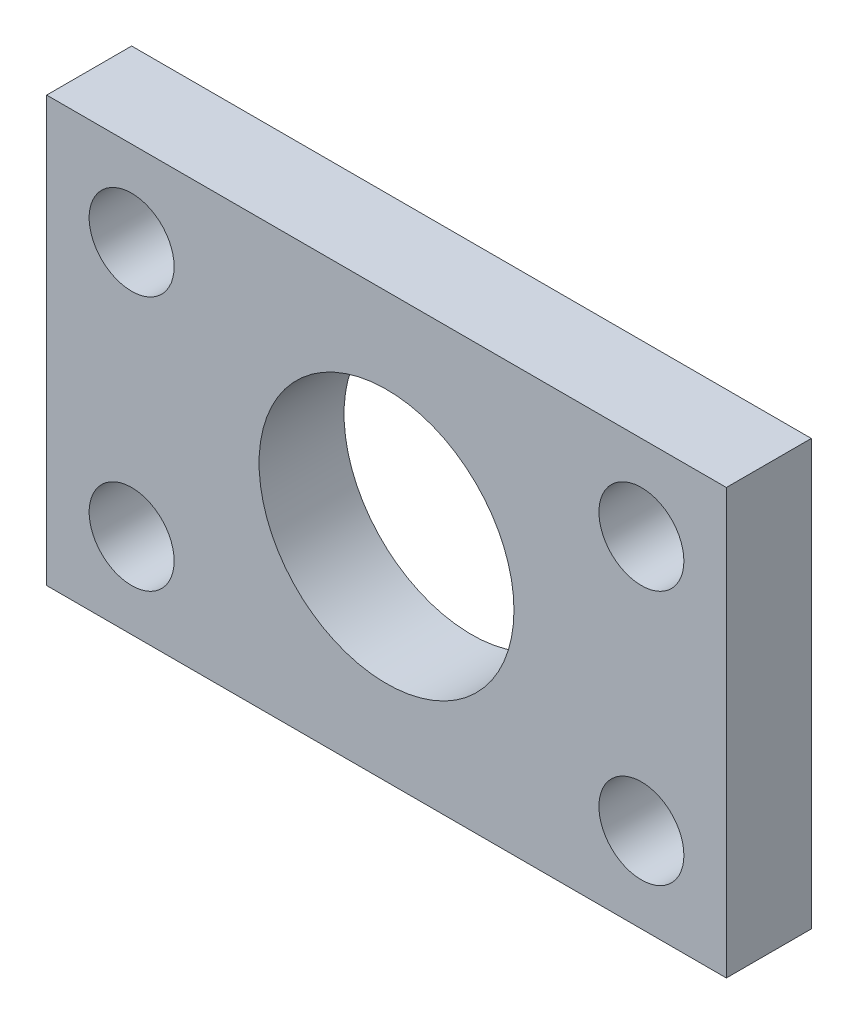
ISO-10303-21;
HEADER;
FILE_DESCRIPTION(('STEP AP214'),'2;1');
FILE_NAME('part.step','',(''),(''),'','','');
FILE_SCHEMA(('AUTOMOTIVE_DESIGN { 1 0 10303 214 1 1 1 1 }'));
ENDSEC;
DATA;
#1=APPLICATION_CONTEXT('core data for automotive mechanical design processes');
#2=APPLICATION_PROTOCOL_DEFINITION('international standard','automotive_design',2000,#1);
#3=PRODUCT_CONTEXT('',#1,'mechanical');
#4=PRODUCT('Part','Part','',(#3));
#5=PRODUCT_RELATED_PRODUCT_CATEGORY('part','',(#4));
#6=PRODUCT_DEFINITION_FORMATION('','',#4);
#7=PRODUCT_DEFINITION_CONTEXT('part definition',#1,'design');
#8=PRODUCT_DEFINITION('design','',#6,#7);
#9=PRODUCT_DEFINITION_SHAPE('','',#8);
#10=(LENGTH_UNIT() NAMED_UNIT(*) SI_UNIT(.MILLI.,.METRE.));
#11=(NAMED_UNIT(*) PLANE_ANGLE_UNIT() SI_UNIT($,.RADIAN.));
#12=(NAMED_UNIT(*) SI_UNIT($,.STERADIAN.) SOLID_ANGLE_UNIT());
#13=UNCERTAINTY_MEASURE_WITH_UNIT(LENGTH_MEASURE(1.E-05),#10,'distance_accuracy_value','');
#14=(GEOMETRIC_REPRESENTATION_CONTEXT(3) GLOBAL_UNCERTAINTY_ASSIGNED_CONTEXT((#13)) GLOBAL_UNIT_ASSIGNED_CONTEXT((#10,
#11,#12)) REPRESENTATION_CONTEXT('',''));
#15=CARTESIAN_POINT('',(0.,0.,0.));
#16=DIRECTION('',(0.,0.,1.));
#17=DIRECTION('',(1.,0.,0.));
#18=AXIS2_PLACEMENT_3D('',#15,#16,#17);
#19=CARTESIAN_POINT('',(0.,0.,25.4));
#20=DIRECTION('',(0.,0.,1.));
#21=DIRECTION('',(1.,0.,0.));
#22=AXIS2_PLACEMENT_3D('',#19,#20,#21);
#23=PLANE('',#22);
#24=CARTESIAN_POINT('',(76.2,38.1,25.4));
#25=DIRECTION('',(0.,0.,1.));
#26=DIRECTION('',(1.,0.,0.));
#27=AXIS2_PLACEMENT_3D('',#24,#25,#26);
#28=CIRCLE('',#27,12.7);
#29=CARTESIAN_POINT('',(88.9,38.1,25.4));
#30=VERTEX_POINT('',#29);
#31=EDGE_CURVE('E131',#30,#30,#28,.T.);
#32=ORIENTED_EDGE('',*,*,#31,.F.);
#33=EDGE_LOOP('',(#32));
#34=FACE_BOUND('',#33,.T.);
#35=CARTESIAN_POINT('',(76.2,-38.1,25.4));
#36=DIRECTION('',(0.,0.,1.));
#37=DIRECTION('',(1.,0.,0.));
#38=AXIS2_PLACEMENT_3D('',#35,#36,#37);
#39=CIRCLE('',#38,12.7);
#40=CARTESIAN_POINT('',(88.9,-38.1,25.4));
#41=VERTEX_POINT('',#40);
#42=EDGE_CURVE('E119',#41,#41,#39,.T.);
#43=ORIENTED_EDGE('',*,*,#42,.F.);
#44=EDGE_LOOP('',(#43));
#45=FACE_BOUND('',#44,.T.);
#46=DIRECTION('',(0.,-1.,0.));
#47=VECTOR('',#46,1.);
#48=CARTESIAN_POINT('',(-101.6,63.5,25.4));
#49=LINE('',#48,#47);
#50=CARTESIAN_POINT('',(-101.6,63.5,25.4));
#51=VERTEX_POINT('',#50);
#52=CARTESIAN_POINT('',(-101.6,-63.5,25.4));
#53=VERTEX_POINT('',#52);
#54=EDGE_CURVE('E89',#51,#53,#49,.T.);
#55=ORIENTED_EDGE('',*,*,#54,.T.);
#56=DIRECTION('',(1.,0.,0.));
#57=VECTOR('',#56,1.);
#58=CARTESIAN_POINT('',(-101.6,-63.5,25.4));
#59=LINE('',#58,#57);
#60=CARTESIAN_POINT('',(101.6,-63.5,25.4));
#61=VERTEX_POINT('',#60);
#62=EDGE_CURVE('E84',#53,#61,#59,.T.);
#63=ORIENTED_EDGE('',*,*,#62,.T.);
#64=DIRECTION('',(0.,1.,0.));
#65=VECTOR('',#64,1.);
#66=CARTESIAN_POINT('',(101.6,63.5,25.4));
#67=LINE('',#66,#65);
#68=CARTESIAN_POINT('',(101.6,63.5,25.4));
#69=VERTEX_POINT('',#68);
#70=EDGE_CURVE('E87',#61,#69,#67,.T.);
#71=ORIENTED_EDGE('',*,*,#70,.T.);
#72=DIRECTION('',(-1.,0.,0.));
#73=VECTOR('',#72,1.);
#74=CARTESIAN_POINT('',(-101.6,63.5,25.4));
#75=LINE('',#74,#73);
#76=EDGE_CURVE('E54',#69,#51,#75,.T.);
#77=ORIENTED_EDGE('',*,*,#76,.T.);
#78=EDGE_LOOP('',(#55,#63,#71,#77));
#79=FACE_BOUND('',#78,.T.);
#80=CARTESIAN_POINT('',(-76.2,38.1,25.4));
#81=DIRECTION('',(0.,0.,1.));
#82=DIRECTION('',(1.,0.,0.));
#83=AXIS2_PLACEMENT_3D('',#80,#81,#82);
#84=CIRCLE('',#83,12.7);
#85=CARTESIAN_POINT('',(-63.5,38.1,25.4));
#86=VERTEX_POINT('',#85);
#87=EDGE_CURVE('E104',#86,#86,#84,.T.);
#88=ORIENTED_EDGE('',*,*,#87,.F.);
#89=EDGE_LOOP('',(#88));
#90=FACE_BOUND('',#89,.T.);
#91=CARTESIAN_POINT('',(-76.2,-38.1,25.4));
#92=DIRECTION('',(0.,0.,1.));
#93=DIRECTION('',(1.,0.,0.));
#94=AXIS2_PLACEMENT_3D('',#91,#92,#93);
#95=CIRCLE('',#94,12.7);
#96=CARTESIAN_POINT('',(-63.5,-38.1,25.4));
#97=VERTEX_POINT('',#96);
#98=EDGE_CURVE('E125',#97,#97,#95,.T.);
#99=ORIENTED_EDGE('',*,*,#98,.F.);
#100=EDGE_LOOP('',(#99));
#101=FACE_BOUND('',#100,.T.);
#102=CARTESIAN_POINT('',(0.,0.,25.4));
#103=DIRECTION('',(0.,0.,1.));
#104=DIRECTION('',(1.,0.,0.));
#105=AXIS2_PLACEMENT_3D('',#102,#103,#104);
#106=CIRCLE('',#105,38.1);
#107=CARTESIAN_POINT('',(38.1,0.,25.4));
#108=VERTEX_POINT('',#107);
#109=EDGE_CURVE('E137',#108,#108,#106,.T.);
#110=ORIENTED_EDGE('',*,*,#109,.F.);
#111=EDGE_LOOP('',(#110));
#112=FACE_BOUND('',#111,.T.);
#113=ADVANCED_FACE('F37',(#34,#45,#79,#90,#101,#112),#23,.T.);
#114=CARTESIAN_POINT('',(0.,0.,0.));
#115=DIRECTION('',(0.,0.,1.));
#116=DIRECTION('',(1.,0.,0.));
#117=AXIS2_PLACEMENT_3D('',#114,#115,#116);
#118=PLANE('',#117);
#119=DIRECTION('',(0.,-1.,0.));
#120=VECTOR('',#119,1.);
#121=CARTESIAN_POINT('',(-101.6,63.5,0.));
#122=LINE('',#121,#120);
#123=CARTESIAN_POINT('',(-101.6,63.5,0.));
#124=VERTEX_POINT('',#123);
#125=CARTESIAN_POINT('',(-101.6,-63.5,0.));
#126=VERTEX_POINT('',#125);
#127=EDGE_CURVE('E101',#124,#126,#122,.T.);
#128=ORIENTED_EDGE('',*,*,#127,.F.);
#129=DIRECTION('',(-1.,0.,0.));
#130=VECTOR('',#129,1.);
#131=CARTESIAN_POINT('',(-101.6,63.5,0.));
#132=LINE('',#131,#130);
#133=CARTESIAN_POINT('',(101.6,63.5,0.));
#134=VERTEX_POINT('',#133);
#135=EDGE_CURVE('E77',#134,#124,#132,.T.);
#136=ORIENTED_EDGE('',*,*,#135,.F.);
#137=DIRECTION('',(0.,1.,0.));
#138=VECTOR('',#137,1.);
#139=CARTESIAN_POINT('',(101.6,63.5,0.));
#140=LINE('',#139,#138);
#141=CARTESIAN_POINT('',(101.6,-63.5,0.));
#142=VERTEX_POINT('',#141);
#143=EDGE_CURVE('E71',#142,#134,#140,.T.);
#144=ORIENTED_EDGE('',*,*,#143,.F.);
#145=DIRECTION('',(1.,0.,0.));
#146=VECTOR('',#145,1.);
#147=CARTESIAN_POINT('',(-101.6,-63.5,0.));
#148=LINE('',#147,#146);
#149=EDGE_CURVE('E93',#126,#142,#148,.T.);
#150=ORIENTED_EDGE('',*,*,#149,.F.);
#151=EDGE_LOOP('',(#128,#136,#144,#150));
#152=FACE_BOUND('',#151,.T.);
#153=CARTESIAN_POINT('',(-76.2,38.1,0.));
#154=DIRECTION('',(0.,0.,1.));
#155=DIRECTION('',(1.,0.,0.));
#156=AXIS2_PLACEMENT_3D('',#153,#154,#155);
#157=CIRCLE('',#156,12.7);
#158=CARTESIAN_POINT('',(-63.5,38.1,0.));
#159=VERTEX_POINT('',#158);
#160=EDGE_CURVE('E116',#159,#159,#157,.T.);
#161=ORIENTED_EDGE('',*,*,#160,.T.);
#162=EDGE_LOOP('',(#161));
#163=FACE_BOUND('',#162,.T.);
#164=CARTESIAN_POINT('',(76.2,-38.1,0.));
#165=DIRECTION('',(0.,0.,1.));
#166=DIRECTION('',(1.,0.,0.));
#167=AXIS2_PLACEMENT_3D('',#164,#165,#166);
#168=CIRCLE('',#167,12.7);
#169=CARTESIAN_POINT('',(88.9,-38.1,0.));
#170=VERTEX_POINT('',#169);
#171=EDGE_CURVE('E122',#170,#170,#168,.T.);
#172=ORIENTED_EDGE('',*,*,#171,.T.);
#173=EDGE_LOOP('',(#172));
#174=FACE_BOUND('',#173,.T.);
#175=CARTESIAN_POINT('',(-76.2,-38.1,0.));
#176=DIRECTION('',(0.,0.,1.));
#177=DIRECTION('',(1.,0.,0.));
#178=AXIS2_PLACEMENT_3D('',#175,#176,#177);
#179=CIRCLE('',#178,12.7);
#180=CARTESIAN_POINT('',(-63.5,-38.1,0.));
#181=VERTEX_POINT('',#180);
#182=EDGE_CURVE('E128',#181,#181,#179,.T.);
#183=ORIENTED_EDGE('',*,*,#182,.T.);
#184=EDGE_LOOP('',(#183));
#185=FACE_BOUND('',#184,.T.);
#186=CARTESIAN_POINT('',(76.2,38.1,0.));
#187=DIRECTION('',(0.,0.,1.));
#188=DIRECTION('',(1.,0.,0.));
#189=AXIS2_PLACEMENT_3D('',#186,#187,#188);
#190=CIRCLE('',#189,12.7);
#191=CARTESIAN_POINT('',(88.9,38.1,0.));
#192=VERTEX_POINT('',#191);
#193=EDGE_CURVE('E134',#192,#192,#190,.T.);
#194=ORIENTED_EDGE('',*,*,#193,.T.);
#195=EDGE_LOOP('',(#194));
#196=FACE_BOUND('',#195,.T.);
#197=CARTESIAN_POINT('',(0.,0.,0.));
#198=DIRECTION('',(0.,0.,1.));
#199=DIRECTION('',(1.,0.,0.));
#200=AXIS2_PLACEMENT_3D('',#197,#198,#199);
#201=CIRCLE('',#200,38.1);
#202=CARTESIAN_POINT('',(38.1,0.,0.));
#203=VERTEX_POINT('',#202);
#204=EDGE_CURVE('E140',#203,#203,#201,.T.);
#205=ORIENTED_EDGE('',*,*,#204,.T.);
#206=EDGE_LOOP('',(#205));
#207=FACE_BOUND('',#206,.T.);
#208=ADVANCED_FACE('F112',(#152,#163,#174,#185,#196,#207),#118,.F.);
#209=CARTESIAN_POINT('',(-101.6,63.5,25.4));
#210=DIRECTION('',(1.,0.,0.));
#211=DIRECTION('',(0.,0.,-1.));
#212=AXIS2_PLACEMENT_3D('',#209,#210,#211);
#213=PLANE('',#212);
#214=ORIENTED_EDGE('',*,*,#127,.T.);
#215=DIRECTION('',(0.,0.,-1.));
#216=VECTOR('',#215,1.);
#217=CARTESIAN_POINT('',(-101.6,-63.5,25.4));
#218=LINE('',#217,#216);
#219=EDGE_CURVE('E11',#53,#126,#218,.T.);
#220=ORIENTED_EDGE('',*,*,#219,.F.);
#221=ORIENTED_EDGE('',*,*,#54,.F.);
#222=DIRECTION('',(0.,0.,-1.));
#223=VECTOR('',#222,1.);
#224=CARTESIAN_POINT('',(-101.6,63.5,25.4));
#225=LINE('',#224,#223);
#226=EDGE_CURVE('E97',#51,#124,#225,.T.);
#227=ORIENTED_EDGE('',*,*,#226,.T.);
#228=EDGE_LOOP('',(#214,#220,#221,#227));
#229=FACE_BOUND('',#228,.T.);
#230=ADVANCED_FACE('F39',(#229),#213,.F.);
#231=CARTESIAN_POINT('',(-101.6,-63.5,25.4));
#232=DIRECTION('',(0.,1.,0.));
#233=DIRECTION('',(0.,0.,1.));
#234=AXIS2_PLACEMENT_3D('',#231,#232,#233);
#235=PLANE('',#234);
#236=ORIENTED_EDGE('',*,*,#149,.T.);
#237=DIRECTION('',(0.,0.,-1.));
#238=VECTOR('',#237,1.);
#239=CARTESIAN_POINT('',(101.6,-63.5,25.4));
#240=LINE('',#239,#238);
#241=EDGE_CURVE('E46',#61,#142,#240,.T.);
#242=ORIENTED_EDGE('',*,*,#241,.F.);
#243=ORIENTED_EDGE('',*,*,#62,.F.);
#244=ORIENTED_EDGE('',*,*,#219,.T.);
#245=EDGE_LOOP('',(#236,#242,#243,#244));
#246=FACE_BOUND('',#245,.T.);
#247=ADVANCED_FACE('F92',(#246),#235,.F.);
#248=CARTESIAN_POINT('',(101.6,63.5,25.4));
#249=DIRECTION('',(-1.,0.,0.));
#250=DIRECTION('',(0.,-1.,0.));
#251=AXIS2_PLACEMENT_3D('',#248,#249,#250);
#252=PLANE('',#251);
#253=ORIENTED_EDGE('',*,*,#143,.T.);
#254=DIRECTION('',(0.,0.,-1.));
#255=VECTOR('',#254,1.);
#256=CARTESIAN_POINT('',(101.6,63.5,25.4));
#257=LINE('',#256,#255);
#258=EDGE_CURVE('E94',#69,#134,#257,.T.);
#259=ORIENTED_EDGE('',*,*,#258,.F.);
#260=ORIENTED_EDGE('',*,*,#70,.F.);
#261=ORIENTED_EDGE('',*,*,#241,.T.);
#262=EDGE_LOOP('',(#253,#259,#260,#261));
#263=FACE_BOUND('',#262,.T.);
#264=ADVANCED_FACE('F95',(#263),#252,.F.);
#265=CARTESIAN_POINT('',(-101.6,63.5,25.4));
#266=DIRECTION('',(0.,-1.,0.));
#267=DIRECTION('',(1.,0.,0.));
#268=AXIS2_PLACEMENT_3D('',#265,#266,#267);
#269=PLANE('',#268);
#270=ORIENTED_EDGE('',*,*,#135,.T.);
#271=ORIENTED_EDGE('',*,*,#226,.F.);
#272=ORIENTED_EDGE('',*,*,#76,.F.);
#273=ORIENTED_EDGE('',*,*,#258,.T.);
#274=EDGE_LOOP('',(#270,#271,#272,#273));
#275=FACE_BOUND('',#274,.T.);
#276=ADVANCED_FACE('F109',(#275),#269,.F.);
#277=CARTESIAN_POINT('',(-76.2,38.1,25.4));
#278=DIRECTION('',(0.,0.,-1.));
#279=DIRECTION('',(-1.,0.,0.));
#280=AXIS2_PLACEMENT_3D('',#277,#278,#279);
#281=CYLINDRICAL_SURFACE('',#280,12.7);
#282=ORIENTED_EDGE('',*,*,#87,.T.);
#283=EDGE_LOOP('',(#282));
#284=FACE_BOUND('',#283,.T.);
#285=ORIENTED_EDGE('',*,*,#160,.F.);
#286=EDGE_LOOP('',(#285));
#287=FACE_BOUND('',#286,.T.);
#288=ADVANCED_FACE('F159',(#284,#287),#281,.F.);
#289=CARTESIAN_POINT('',(76.2,-38.1,25.4));
#290=DIRECTION('',(0.,0.,-1.));
#291=DIRECTION('',(-1.,0.,0.));
#292=AXIS2_PLACEMENT_3D('',#289,#290,#291);
#293=CYLINDRICAL_SURFACE('',#292,12.7);
#294=ORIENTED_EDGE('',*,*,#42,.T.);
#295=EDGE_LOOP('',(#294));
#296=FACE_BOUND('',#295,.T.);
#297=ORIENTED_EDGE('',*,*,#171,.F.);
#298=EDGE_LOOP('',(#297));
#299=FACE_BOUND('',#298,.T.);
#300=ADVANCED_FACE('F213',(#296,#299),#293,.F.);
#301=CARTESIAN_POINT('',(-76.2,-38.1,25.4));
#302=DIRECTION('',(0.,0.,-1.));
#303=DIRECTION('',(-1.,0.,0.));
#304=AXIS2_PLACEMENT_3D('',#301,#302,#303);
#305=CYLINDRICAL_SURFACE('',#304,12.7);
#306=ORIENTED_EDGE('',*,*,#98,.T.);
#307=EDGE_LOOP('',(#306));
#308=FACE_BOUND('',#307,.T.);
#309=ORIENTED_EDGE('',*,*,#182,.F.);
#310=EDGE_LOOP('',(#309));
#311=FACE_BOUND('',#310,.T.);
#312=ADVANCED_FACE('F222',(#308,#311),#305,.F.);
#313=CARTESIAN_POINT('',(76.2,38.1,25.4));
#314=DIRECTION('',(0.,0.,-1.));
#315=DIRECTION('',(-1.,0.,0.));
#316=AXIS2_PLACEMENT_3D('',#313,#314,#315);
#317=CYLINDRICAL_SURFACE('',#316,12.7);
#318=ORIENTED_EDGE('',*,*,#31,.T.);
#319=EDGE_LOOP('',(#318));
#320=FACE_BOUND('',#319,.T.);
#321=ORIENTED_EDGE('',*,*,#193,.F.);
#322=EDGE_LOOP('',(#321));
#323=FACE_BOUND('',#322,.T.);
#324=ADVANCED_FACE('F231',(#320,#323),#317,.F.);
#325=CARTESIAN_POINT('',(0.,0.,25.4));
#326=DIRECTION('',(0.,0.,-1.));
#327=DIRECTION('',(-1.,0.,0.));
#328=AXIS2_PLACEMENT_3D('',#325,#326,#327);
#329=CYLINDRICAL_SURFACE('',#328,38.1);
#330=ORIENTED_EDGE('',*,*,#109,.T.);
#331=EDGE_LOOP('',(#330));
#332=FACE_BOUND('',#331,.T.);
#333=ORIENTED_EDGE('',*,*,#204,.F.);
#334=EDGE_LOOP('',(#333));
#335=FACE_BOUND('',#334,.T.);
#336=ADVANCED_FACE('F146',(#332,#335),#329,.F.);
#337=CLOSED_SHELL('',(#113,#208,#230,#247,#264,#276,#288,#300,#312,#324,#336));
#338=MANIFOLD_SOLID_BREP('B2',#337);
#339=ADVANCED_BREP_SHAPE_REPRESENTATION('',(#18,#338),#14);
#340=SHAPE_DEFINITION_REPRESENTATION(#9,#339);
ENDSEC;
END-ISO-10303-21;
